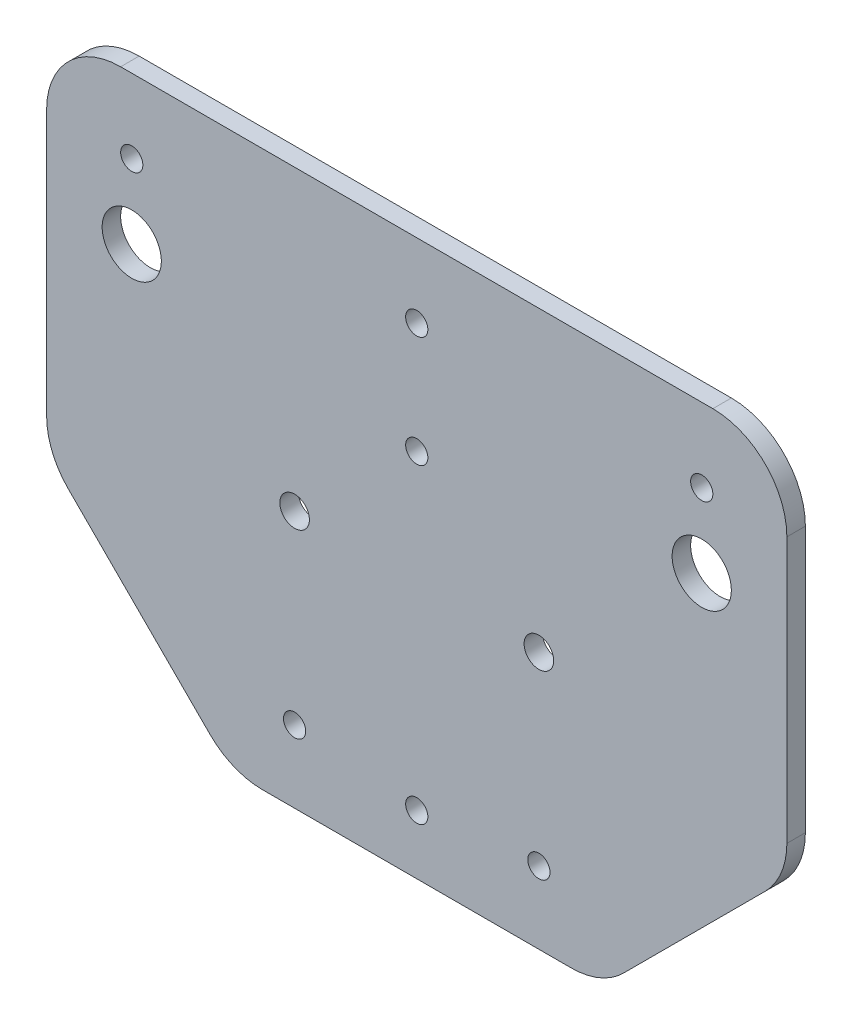
ISO-10303-21;
HEADER;
FILE_DESCRIPTION(('STEP AP214'),'2;1');
FILE_NAME('part.step','',(''),(''),'','','');
FILE_SCHEMA(('AUTOMOTIVE_DESIGN { 1 0 10303 214 1 1 1 1 }'));
ENDSEC;
DATA;
#1=APPLICATION_CONTEXT('core data for automotive mechanical design processes');
#2=APPLICATION_PROTOCOL_DEFINITION('international standard','automotive_design',2000,#1);
#3=PRODUCT_CONTEXT('',#1,'mechanical');
#4=PRODUCT('Part','Part','',(#3));
#5=PRODUCT_RELATED_PRODUCT_CATEGORY('part','',(#4));
#6=PRODUCT_DEFINITION_FORMATION('','',#4);
#7=PRODUCT_DEFINITION_CONTEXT('part definition',#1,'design');
#8=PRODUCT_DEFINITION('design','',#6,#7);
#9=PRODUCT_DEFINITION_SHAPE('','',#8);
#10=(LENGTH_UNIT() NAMED_UNIT(*) SI_UNIT(.MILLI.,.METRE.));
#11=(NAMED_UNIT(*) PLANE_ANGLE_UNIT() SI_UNIT($,.RADIAN.));
#12=(NAMED_UNIT(*) SI_UNIT($,.STERADIAN.) SOLID_ANGLE_UNIT());
#13=UNCERTAINTY_MEASURE_WITH_UNIT(LENGTH_MEASURE(1.E-05),#10,'distance_accuracy_value','');
#14=(GEOMETRIC_REPRESENTATION_CONTEXT(3) GLOBAL_UNCERTAINTY_ASSIGNED_CONTEXT((#13)) GLOBAL_UNIT_ASSIGNED_CONTEXT((#10,
#11,#12)) REPRESENTATION_CONTEXT('',''));
#15=CARTESIAN_POINT('',(0.,0.,0.));
#16=DIRECTION('',(0.,0.,1.));
#17=DIRECTION('',(1.,0.,0.));
#18=AXIS2_PLACEMENT_3D('',#15,#16,#17);
#19=CARTESIAN_POINT('',(-16.5,-2.74999999999998,1.25));
#20=DIRECTION('',(0.,0.,-1.));
#21=DIRECTION('',(-1.,0.,0.));
#22=AXIS2_PLACEMENT_3D('',#19,#20,#21);
#23=CYLINDRICAL_SURFACE('',#22,2.);
#24=CARTESIAN_POINT('',(-16.5,-2.74999999999998,1.25));
#25=DIRECTION('',(0.,0.,1.));
#26=DIRECTION('',(1.,0.,0.));
#27=AXIS2_PLACEMENT_3D('',#24,#25,#26);
#28=CIRCLE('',#27,2.);
#29=CARTESIAN_POINT('',(-14.5,-2.74999999999998,1.25));
#30=VERTEX_POINT('',#29);
#31=EDGE_CURVE('E293',#30,#30,#28,.T.);
#32=ORIENTED_EDGE('',*,*,#31,.T.);
#33=EDGE_LOOP('',(#32));
#34=FACE_BOUND('',#33,.T.);
#35=CARTESIAN_POINT('',(-16.5,-2.74999999999998,-1.25));
#36=DIRECTION('',(0.,0.,1.));
#37=DIRECTION('',(1.,0.,0.));
#38=AXIS2_PLACEMENT_3D('',#35,#36,#37);
#39=CIRCLE('',#38,2.);
#40=CARTESIAN_POINT('',(-14.5,-2.74999999999998,-1.25));
#41=VERTEX_POINT('',#40);
#42=EDGE_CURVE('E287',#41,#41,#39,.T.);
#43=ORIENTED_EDGE('',*,*,#42,.F.);
#44=EDGE_LOOP('',(#43));
#45=FACE_BOUND('',#44,.T.);
#46=ADVANCED_FACE('F123',(#34,#45),#23,.F.);
#47=CARTESIAN_POINT('',(-38.5,27.5,1.25));
#48=DIRECTION('',(0.,0.,-1.));
#49=DIRECTION('',(-1.,0.,0.));
#50=AXIS2_PLACEMENT_3D('',#47,#48,#49);
#51=CYLINDRICAL_SURFACE('',#50,1.5);
#52=CARTESIAN_POINT('',(-38.5,27.5,1.25));
#53=DIRECTION('',(0.,0.,1.));
#54=DIRECTION('',(1.,0.,0.));
#55=AXIS2_PLACEMENT_3D('',#52,#53,#54);
#56=CIRCLE('',#55,1.5);
#57=CARTESIAN_POINT('',(-37.,27.5,1.25));
#58=VERTEX_POINT('',#57);
#59=EDGE_CURVE('E399',#58,#58,#56,.F.);
#60=ORIENTED_EDGE('',*,*,#59,.F.);
#61=EDGE_LOOP('',(#60));
#62=FACE_BOUND('',#61,.T.);
#63=CARTESIAN_POINT('',(-38.5,27.5,-1.25));
#64=DIRECTION('',(0.,0.,1.));
#65=DIRECTION('',(1.,0.,0.));
#66=AXIS2_PLACEMENT_3D('',#63,#64,#65);
#67=CIRCLE('',#66,1.5);
#68=CARTESIAN_POINT('',(-37.,27.5,-1.25));
#69=VERTEX_POINT('',#68);
#70=EDGE_CURVE('E283',#69,#69,#67,.F.);
#71=ORIENTED_EDGE('',*,*,#70,.T.);
#72=EDGE_LOOP('',(#71));
#73=FACE_BOUND('',#72,.T.);
#74=ADVANCED_FACE('F494',(#62,#73),#51,.F.);
#75=CARTESIAN_POINT('',(38.5,27.5,1.25));
#76=DIRECTION('',(0.,0.,-1.));
#77=DIRECTION('',(-1.,0.,0.));
#78=AXIS2_PLACEMENT_3D('',#75,#76,#77);
#79=CYLINDRICAL_SURFACE('',#78,1.5);
#80=CARTESIAN_POINT('',(38.5,27.5,1.25));
#81=DIRECTION('',(0.,0.,1.));
#82=DIRECTION('',(1.,0.,0.));
#83=AXIS2_PLACEMENT_3D('',#80,#81,#82);
#84=CIRCLE('',#83,1.5);
#85=CARTESIAN_POINT('',(40.,27.5,1.25));
#86=VERTEX_POINT('',#85);
#87=EDGE_CURVE('E395',#86,#86,#84,.T.);
#88=ORIENTED_EDGE('',*,*,#87,.T.);
#89=EDGE_LOOP('',(#88));
#90=FACE_BOUND('',#89,.T.);
#91=CARTESIAN_POINT('',(38.5,27.5,-1.25));
#92=DIRECTION('',(0.,0.,1.));
#93=DIRECTION('',(1.,0.,0.));
#94=AXIS2_PLACEMENT_3D('',#91,#92,#93);
#95=CIRCLE('',#94,1.5);
#96=CARTESIAN_POINT('',(40.,27.5,-1.25));
#97=VERTEX_POINT('',#96);
#98=EDGE_CURVE('E279',#97,#97,#95,.T.);
#99=ORIENTED_EDGE('',*,*,#98,.F.);
#100=EDGE_LOOP('',(#99));
#101=FACE_BOUND('',#100,.T.);
#102=ADVANCED_FACE('F499',(#90,#101),#79,.F.);
#103=CARTESIAN_POINT('',(16.5,-2.74999999999997,1.25));
#104=DIRECTION('',(0.,0.,-1.));
#105=DIRECTION('',(-1.,0.,0.));
#106=AXIS2_PLACEMENT_3D('',#103,#104,#105);
#107=CYLINDRICAL_SURFACE('',#106,2.);
#108=CARTESIAN_POINT('',(16.5,-2.74999999999997,1.25));
#109=DIRECTION('',(0.,0.,1.));
#110=DIRECTION('',(1.,0.,0.));
#111=AXIS2_PLACEMENT_3D('',#108,#109,#110);
#112=CIRCLE('',#111,2.);
#113=CARTESIAN_POINT('',(18.5,-2.74999999999997,1.25));
#114=VERTEX_POINT('',#113);
#115=EDGE_CURVE('E391',#114,#114,#112,.T.);
#116=ORIENTED_EDGE('',*,*,#115,.T.);
#117=EDGE_LOOP('',(#116));
#118=FACE_BOUND('',#117,.T.);
#119=CARTESIAN_POINT('',(16.5,-2.74999999999997,-1.25));
#120=DIRECTION('',(0.,0.,1.));
#121=DIRECTION('',(1.,0.,0.));
#122=AXIS2_PLACEMENT_3D('',#119,#120,#121);
#123=CIRCLE('',#122,2.);
#124=CARTESIAN_POINT('',(18.5,-2.74999999999997,-1.25));
#125=VERTEX_POINT('',#124);
#126=EDGE_CURVE('E275',#125,#125,#123,.T.);
#127=ORIENTED_EDGE('',*,*,#126,.F.);
#128=EDGE_LOOP('',(#127));
#129=FACE_BOUND('',#128,.T.);
#130=ADVANCED_FACE('F506',(#118,#129),#107,.F.);
#131=CARTESIAN_POINT('',(16.5,-27.75,1.25));
#132=DIRECTION('',(0.,0.,-1.));
#133=DIRECTION('',(-1.,0.,0.));
#134=AXIS2_PLACEMENT_3D('',#131,#132,#133);
#135=CYLINDRICAL_SURFACE('',#134,1.5);
#136=CARTESIAN_POINT('',(16.5,-27.75,1.25));
#137=DIRECTION('',(0.,0.,1.));
#138=DIRECTION('',(1.,0.,0.));
#139=AXIS2_PLACEMENT_3D('',#136,#137,#138);
#140=CIRCLE('',#139,1.5);
#141=CARTESIAN_POINT('',(18.,-27.75,1.25));
#142=VERTEX_POINT('',#141);
#143=EDGE_CURVE('E387',#142,#142,#140,.F.);
#144=ORIENTED_EDGE('',*,*,#143,.F.);
#145=EDGE_LOOP('',(#144));
#146=FACE_BOUND('',#145,.T.);
#147=CARTESIAN_POINT('',(16.5,-27.75,-1.25));
#148=DIRECTION('',(0.,0.,1.));
#149=DIRECTION('',(1.,0.,0.));
#150=AXIS2_PLACEMENT_3D('',#147,#148,#149);
#151=CIRCLE('',#150,1.5);
#152=CARTESIAN_POINT('',(18.,-27.75,-1.25));
#153=VERTEX_POINT('',#152);
#154=EDGE_CURVE('E271',#153,#153,#151,.F.);
#155=ORIENTED_EDGE('',*,*,#154,.T.);
#156=EDGE_LOOP('',(#155));
#157=FACE_BOUND('',#156,.T.);
#158=ADVANCED_FACE('F510',(#146,#157),#135,.F.);
#159=CARTESIAN_POINT('',(-16.5,-27.75,1.25));
#160=DIRECTION('',(0.,0.,-1.));
#161=DIRECTION('',(-1.,0.,0.));
#162=AXIS2_PLACEMENT_3D('',#159,#160,#161);
#163=CYLINDRICAL_SURFACE('',#162,1.5);
#164=CARTESIAN_POINT('',(-16.5,-27.75,1.25));
#165=DIRECTION('',(0.,0.,1.));
#166=DIRECTION('',(1.,0.,0.));
#167=AXIS2_PLACEMENT_3D('',#164,#165,#166);
#168=CIRCLE('',#167,1.5);
#169=CARTESIAN_POINT('',(-15.,-27.75,1.25));
#170=VERTEX_POINT('',#169);
#171=EDGE_CURVE('E383',#170,#170,#168,.T.);
#172=ORIENTED_EDGE('',*,*,#171,.T.);
#173=EDGE_LOOP('',(#172));
#174=FACE_BOUND('',#173,.T.);
#175=CARTESIAN_POINT('',(-16.5,-27.75,-1.25));
#176=DIRECTION('',(0.,0.,1.));
#177=DIRECTION('',(1.,0.,0.));
#178=AXIS2_PLACEMENT_3D('',#175,#176,#177);
#179=CIRCLE('',#178,1.5);
#180=CARTESIAN_POINT('',(-15.,-27.75,-1.25));
#181=VERTEX_POINT('',#180);
#182=EDGE_CURVE('E267',#181,#181,#179,.T.);
#183=ORIENTED_EDGE('',*,*,#182,.F.);
#184=EDGE_LOOP('',(#183));
#185=FACE_BOUND('',#184,.T.);
#186=ADVANCED_FACE('F514',(#174,#185),#163,.F.);
#187=CARTESIAN_POINT('',(0.,-29.5,1.25));
#188=DIRECTION('',(0.,0.,-1.));
#189=DIRECTION('',(-1.,0.,0.));
#190=AXIS2_PLACEMENT_3D('',#187,#188,#189);
#191=CYLINDRICAL_SURFACE('',#190,1.5);
#192=CARTESIAN_POINT('',(0.,-29.5,1.25));
#193=DIRECTION('',(0.,0.,1.));
#194=DIRECTION('',(1.,0.,0.));
#195=AXIS2_PLACEMENT_3D('',#192,#193,#194);
#196=CIRCLE('',#195,1.5);
#197=CARTESIAN_POINT('',(1.5,-29.5,1.25));
#198=VERTEX_POINT('',#197);
#199=EDGE_CURVE('E375',#198,#198,#196,.T.);
#200=ORIENTED_EDGE('',*,*,#199,.T.);
#201=EDGE_LOOP('',(#200));
#202=FACE_BOUND('',#201,.T.);
#203=CARTESIAN_POINT('',(0.,-29.5,-1.25));
#204=DIRECTION('',(0.,0.,1.));
#205=DIRECTION('',(1.,0.,0.));
#206=AXIS2_PLACEMENT_3D('',#203,#204,#205);
#207=CIRCLE('',#206,1.5);
#208=CARTESIAN_POINT('',(1.5,-29.5,-1.25));
#209=VERTEX_POINT('',#208);
#210=EDGE_CURVE('E263',#209,#209,#207,.T.);
#211=ORIENTED_EDGE('',*,*,#210,.F.);
#212=EDGE_LOOP('',(#211));
#213=FACE_BOUND('',#212,.T.);
#214=ADVANCED_FACE('F518',(#202,#213),#191,.F.);
#215=CARTESIAN_POINT('',(0.,37.5,1.25));
#216=DIRECTION('',(0.,-1.,0.));
#217=DIRECTION('',(0.,0.,-1.));
#218=AXIS2_PLACEMENT_3D('',#215,#216,#217);
#219=PLANE('',#218);
#220=DIRECTION('',(-1.,0.,0.));
#221=VECTOR('',#220,1.);
#222=CARTESIAN_POINT('',(0.,37.5,-1.25));
#223=LINE('',#222,#221);
#224=CARTESIAN_POINT('',(40.,37.5,-1.25));
#225=VERTEX_POINT('',#224);
#226=CARTESIAN_POINT('',(-40.,37.5,-1.25));
#227=VERTEX_POINT('',#226);
#228=EDGE_CURVE('E245',#225,#227,#223,.T.);
#229=ORIENTED_EDGE('',*,*,#228,.T.);
#230=DIRECTION('',(0.,0.,-1.));
#231=VECTOR('',#230,1.);
#232=CARTESIAN_POINT('',(-40.,37.5,1.25));
#233=LINE('',#232,#231);
#234=CARTESIAN_POINT('',(-40.,37.5,1.25));
#235=VERTEX_POINT('',#234);
#236=EDGE_CURVE('E219',#227,#235,#233,.F.);
#237=ORIENTED_EDGE('',*,*,#236,.T.);
#238=DIRECTION('',(-1.,0.,0.));
#239=VECTOR('',#238,1.);
#240=CARTESIAN_POINT('',(0.,37.5,1.25));
#241=LINE('',#240,#239);
#242=CARTESIAN_POINT('',(40.,37.5,1.25));
#243=VERTEX_POINT('',#242);
#244=EDGE_CURVE('E438',#243,#235,#241,.T.);
#245=ORIENTED_EDGE('',*,*,#244,.F.);
#246=DIRECTION('',(0.,0.,-1.));
#247=VECTOR('',#246,1.);
#248=CARTESIAN_POINT('',(40.,37.5,-1.25));
#249=LINE('',#248,#247);
#250=EDGE_CURVE('E225',#243,#225,#249,.T.);
#251=ORIENTED_EDGE('',*,*,#250,.T.);
#252=EDGE_LOOP('',(#229,#237,#245,#251));
#253=FACE_BOUND('',#252,.T.);
#254=ADVANCED_FACE('F441',(#253),#219,.F.);
#255=CARTESIAN_POINT('',(-50.,0.,1.25));
#256=DIRECTION('',(1.,0.,0.));
#257=DIRECTION('',(0.,0.,-1.));
#258=AXIS2_PLACEMENT_3D('',#255,#256,#257);
#259=PLANE('',#258);
#260=DIRECTION('',(0.,-1.,0.));
#261=VECTOR('',#260,1.);
#262=CARTESIAN_POINT('',(-50.,0.,1.25));
#263=LINE('',#262,#261);
#264=CARTESIAN_POINT('',(-50.,27.5,1.25));
#265=VERTEX_POINT('',#264);
#266=CARTESIAN_POINT('',(-50.,-8.35786437626905,1.25));
#267=VERTEX_POINT('',#266);
#268=EDGE_CURVE('E235',#265,#267,#263,.T.);
#269=ORIENTED_EDGE('',*,*,#268,.F.);
#270=DIRECTION('',(0.,0.,-1.));
#271=VECTOR('',#270,1.);
#272=CARTESIAN_POINT('',(-50.,27.5,1.25));
#273=LINE('',#272,#271);
#274=CARTESIAN_POINT('',(-50.,27.5,-1.25));
#275=VERTEX_POINT('',#274);
#276=EDGE_CURVE('E218',#265,#275,#273,.T.);
#277=ORIENTED_EDGE('',*,*,#276,.T.);
#278=DIRECTION('',(0.,-1.,0.));
#279=VECTOR('',#278,1.);
#280=CARTESIAN_POINT('',(-50.,0.,-1.25));
#281=LINE('',#280,#279);
#282=CARTESIAN_POINT('',(-50.,-8.35786437626905,-1.25));
#283=VERTEX_POINT('',#282);
#284=EDGE_CURVE('E232',#275,#283,#281,.T.);
#285=ORIENTED_EDGE('',*,*,#284,.T.);
#286=DIRECTION('',(0.,0.,-1.));
#287=VECTOR('',#286,1.);
#288=CARTESIAN_POINT('',(-50.,-8.35786437626905,1.25));
#289=LINE('',#288,#287);
#290=EDGE_CURVE('E238',#283,#267,#289,.F.);
#291=ORIENTED_EDGE('',*,*,#290,.T.);
#292=EDGE_LOOP('',(#269,#277,#285,#291));
#293=FACE_BOUND('',#292,.T.);
#294=ADVANCED_FACE('F231',(#293),#259,.F.);
#295=CARTESIAN_POINT('',(-31.25,-31.25,1.25));
#296=DIRECTION('',(0.707106781186547,0.707106781186548,0.));
#297=DIRECTION('',(-0.707106781186548,0.707106781186547,0.));
#298=AXIS2_PLACEMENT_3D('',#295,#296,#297);
#299=PLANE('',#298);
#300=DIRECTION('',(0.707106781186548,-0.707106781186547,0.));
#301=VECTOR('',#300,1.);
#302=CARTESIAN_POINT('',(-31.25,-31.25,-1.25));
#303=LINE('',#302,#301);
#304=CARTESIAN_POINT('',(-47.0710678118655,-15.4289321881345,-1.25));
#305=VERTEX_POINT('',#304);
#306=CARTESIAN_POINT('',(-27.9289321881345,-34.5710678118655,-1.25));
#307=VERTEX_POINT('',#306);
#308=EDGE_CURVE('E244',#305,#307,#303,.T.);
#309=ORIENTED_EDGE('',*,*,#308,.T.);
#310=DIRECTION('',(0.,0.,-1.));
#311=VECTOR('',#310,1.);
#312=CARTESIAN_POINT('',(-27.9289321881345,-34.5710678118655,1.25));
#313=LINE('',#312,#311);
#314=CARTESIAN_POINT('',(-27.9289321881345,-34.5710678118655,1.25));
#315=VERTEX_POINT('',#314);
#316=EDGE_CURVE('E12',#307,#315,#313,.F.);
#317=ORIENTED_EDGE('',*,*,#316,.T.);
#318=DIRECTION('',(0.707106781186548,-0.707106781186547,0.));
#319=VECTOR('',#318,1.);
#320=CARTESIAN_POINT('',(-31.25,-31.25,1.25));
#321=LINE('',#320,#319);
#322=CARTESIAN_POINT('',(-47.0710678118655,-15.4289321881345,1.25));
#323=VERTEX_POINT('',#322);
#324=EDGE_CURVE('E357',#323,#315,#321,.T.);
#325=ORIENTED_EDGE('',*,*,#324,.F.);
#326=DIRECTION('',(0.,0.,-1.));
#327=VECTOR('',#326,1.);
#328=CARTESIAN_POINT('',(-47.0710678118655,-15.4289321881345,1.25));
#329=LINE('',#328,#327);
#330=EDGE_CURVE('E132',#323,#305,#329,.T.);
#331=ORIENTED_EDGE('',*,*,#330,.T.);
#332=EDGE_LOOP('',(#309,#317,#325,#331));
#333=FACE_BOUND('',#332,.T.);
#334=ADVANCED_FACE('F354',(#333),#299,.F.);
#335=CARTESIAN_POINT('',(0.,-37.5,1.25));
#336=DIRECTION('',(0.,1.,0.));
#337=DIRECTION('',(-1.,0.,0.));
#338=AXIS2_PLACEMENT_3D('',#335,#336,#337);
#339=PLANE('',#338);
#340=DIRECTION('',(1.,0.,0.));
#341=VECTOR('',#340,1.);
#342=CARTESIAN_POINT('',(0.,-37.5,-1.25));
#343=LINE('',#342,#341);
#344=CARTESIAN_POINT('',(-20.857864376269,-37.5,-1.25));
#345=VERTEX_POINT('',#344);
#346=CARTESIAN_POINT('',(20.8578643762691,-37.5,-1.25));
#347=VERTEX_POINT('',#346);
#348=EDGE_CURVE('E250',#345,#347,#343,.T.);
#349=ORIENTED_EDGE('',*,*,#348,.T.);
#350=DIRECTION('',(0.,0.,-1.));
#351=VECTOR('',#350,1.);
#352=CARTESIAN_POINT('',(20.8578643762691,-37.5,1.25));
#353=LINE('',#352,#351);
#354=CARTESIAN_POINT('',(20.8578643762691,-37.5,1.25));
#355=VERTEX_POINT('',#354);
#356=EDGE_CURVE('E347',#347,#355,#353,.F.);
#357=ORIENTED_EDGE('',*,*,#356,.T.);
#358=DIRECTION('',(1.,0.,0.));
#359=VECTOR('',#358,1.);
#360=CARTESIAN_POINT('',(0.,-37.5,1.25));
#361=LINE('',#360,#359);
#362=CARTESIAN_POINT('',(-20.857864376269,-37.5,1.25));
#363=VERTEX_POINT('',#362);
#364=EDGE_CURVE('E369',#363,#355,#361,.T.);
#365=ORIENTED_EDGE('',*,*,#364,.F.);
#366=DIRECTION('',(0.,0.,-1.));
#367=VECTOR('',#366,1.);
#368=CARTESIAN_POINT('',(-20.857864376269,-37.5,1.25));
#369=LINE('',#368,#367);
#370=EDGE_CURVE('E343',#363,#345,#369,.T.);
#371=ORIENTED_EDGE('',*,*,#370,.T.);
#372=EDGE_LOOP('',(#349,#357,#365,#371));
#373=FACE_BOUND('',#372,.T.);
#374=ADVANCED_FACE('F367',(#373),#339,.F.);
#375=CARTESIAN_POINT('',(31.25,-31.25,1.25));
#376=DIRECTION('',(0.707106781186547,-0.707106781186548,0.));
#377=DIRECTION('',(0.707106781186548,0.707106781186547,0.));
#378=AXIS2_PLACEMENT_3D('',#375,#376,#377);
#379=PLANE('',#378);
#380=DIRECTION('',(-0.707106781186548,-0.707106781186547,0.));
#381=VECTOR('',#380,1.);
#382=CARTESIAN_POINT('',(31.25,-31.25,-1.25));
#383=LINE('',#382,#381);
#384=CARTESIAN_POINT('',(47.0710678118655,-15.4289321881345,-1.25));
#385=VERTEX_POINT('',#384);
#386=CARTESIAN_POINT('',(27.9289321881345,-34.5710678118655,-1.25));
#387=VERTEX_POINT('',#386);
#388=EDGE_CURVE('E259',#385,#387,#383,.T.);
#389=ORIENTED_EDGE('',*,*,#388,.F.);
#390=DIRECTION('',(0.,0.,-1.));
#391=VECTOR('',#390,1.);
#392=CARTESIAN_POINT('',(47.0710678118655,-15.4289321881345,1.25));
#393=LINE('',#392,#391);
#394=CARTESIAN_POINT('',(47.0710678118655,-15.4289321881345,1.25));
#395=VERTEX_POINT('',#394);
#396=EDGE_CURVE('E146',#385,#395,#393,.F.);
#397=ORIENTED_EDGE('',*,*,#396,.T.);
#398=DIRECTION('',(-0.707106781186548,-0.707106781186547,0.));
#399=VECTOR('',#398,1.);
#400=CARTESIAN_POINT('',(31.25,-31.25,1.25));
#401=LINE('',#400,#399);
#402=CARTESIAN_POINT('',(27.9289321881345,-34.5710678118655,1.25));
#403=VERTEX_POINT('',#402);
#404=EDGE_CURVE('E371',#395,#403,#401,.T.);
#405=ORIENTED_EDGE('',*,*,#404,.T.);
#406=DIRECTION('',(0.,0.,-1.));
#407=VECTOR('',#406,1.);
#408=CARTESIAN_POINT('',(27.9289321881345,-34.5710678118655,-1.25));
#409=LINE('',#408,#407);
#410=EDGE_CURVE('E337',#403,#387,#409,.T.);
#411=ORIENTED_EDGE('',*,*,#410,.T.);
#412=EDGE_LOOP('',(#389,#397,#405,#411));
#413=FACE_BOUND('',#412,.T.);
#414=ADVANCED_FACE('F523',(#413),#379,.T.);
#415=CARTESIAN_POINT('',(50.,0.,1.25));
#416=DIRECTION('',(1.,0.,0.));
#417=DIRECTION('',(0.,0.,-1.));
#418=AXIS2_PLACEMENT_3D('',#415,#416,#417);
#419=PLANE('',#418);
#420=DIRECTION('',(0.,-1.,0.));
#421=VECTOR('',#420,1.);
#422=CARTESIAN_POINT('',(50.,0.,-1.25));
#423=LINE('',#422,#421);
#424=CARTESIAN_POINT('',(50.,27.5,-1.25));
#425=VERTEX_POINT('',#424);
#426=CARTESIAN_POINT('',(50.,-8.35786437626906,-1.25));
#427=VERTEX_POINT('',#426);
#428=EDGE_CURVE('E252',#425,#427,#423,.T.);
#429=ORIENTED_EDGE('',*,*,#428,.F.);
#430=DIRECTION('',(0.,0.,-1.));
#431=VECTOR('',#430,1.);
#432=CARTESIAN_POINT('',(50.,27.5,1.25));
#433=LINE('',#432,#431);
#434=CARTESIAN_POINT('',(50.,27.5,1.25));
#435=VERTEX_POINT('',#434);
#436=EDGE_CURVE('E334',#425,#435,#433,.F.);
#437=ORIENTED_EDGE('',*,*,#436,.T.);
#438=DIRECTION('',(0.,-1.,0.));
#439=VECTOR('',#438,1.);
#440=CARTESIAN_POINT('',(50.,0.,1.25));
#441=LINE('',#440,#439);
#442=CARTESIAN_POINT('',(50.,-8.35786437626906,1.25));
#443=VERTEX_POINT('',#442);
#444=EDGE_CURVE('E439',#435,#443,#441,.T.);
#445=ORIENTED_EDGE('',*,*,#444,.T.);
#446=DIRECTION('',(0.,0.,-1.));
#447=VECTOR('',#446,1.);
#448=CARTESIAN_POINT('',(50.,-8.35786437626906,1.25));
#449=LINE('',#448,#447);
#450=EDGE_CURVE('E330',#443,#427,#449,.T.);
#451=ORIENTED_EDGE('',*,*,#450,.T.);
#452=EDGE_LOOP('',(#429,#437,#445,#451));
#453=FACE_BOUND('',#452,.T.);
#454=ADVANCED_FACE('F426',(#453),#419,.T.);
#455=CARTESIAN_POINT('',(-38.5,17.5,1.25));
#456=DIRECTION('',(0.,0.,-1.));
#457=DIRECTION('',(-1.,0.,0.));
#458=AXIS2_PLACEMENT_3D('',#455,#456,#457);
#459=CYLINDRICAL_SURFACE('',#458,4.);
#460=CARTESIAN_POINT('',(-38.5,17.5,1.25));
#461=DIRECTION('',(0.,0.,1.));
#462=DIRECTION('',(1.,0.,0.));
#463=AXIS2_PLACEMENT_3D('',#460,#461,#462);
#464=CIRCLE('',#463,4.);
#465=CARTESIAN_POINT('',(-34.5,17.5,1.25));
#466=VERTEX_POINT('',#465);
#467=EDGE_CURVE('E446',#466,#466,#464,.T.);
#468=ORIENTED_EDGE('',*,*,#467,.T.);
#469=EDGE_LOOP('',(#468));
#470=FACE_BOUND('',#469,.T.);
#471=CARTESIAN_POINT('',(-38.5,17.5,-1.25));
#472=DIRECTION('',(0.,0.,1.));
#473=DIRECTION('',(1.,0.,0.));
#474=AXIS2_PLACEMENT_3D('',#471,#472,#473);
#475=CIRCLE('',#474,4.);
#476=CARTESIAN_POINT('',(-34.5,17.5,-1.25));
#477=VERTEX_POINT('',#476);
#478=EDGE_CURVE('E418',#477,#477,#475,.T.);
#479=ORIENTED_EDGE('',*,*,#478,.F.);
#480=EDGE_LOOP('',(#479));
#481=FACE_BOUND('',#480,.T.);
#482=ADVANCED_FACE('F476',(#470,#481),#459,.F.);
#483=CARTESIAN_POINT('',(38.5,17.5,1.25));
#484=DIRECTION('',(0.,0.,-1.));
#485=DIRECTION('',(-1.,0.,0.));
#486=AXIS2_PLACEMENT_3D('',#483,#484,#485);
#487=CYLINDRICAL_SURFACE('',#486,4.);
#488=CARTESIAN_POINT('',(38.5,17.5,1.25));
#489=DIRECTION('',(0.,0.,1.));
#490=DIRECTION('',(1.,0.,0.));
#491=AXIS2_PLACEMENT_3D('',#488,#489,#490);
#492=CIRCLE('',#491,4.);
#493=CARTESIAN_POINT('',(42.5,17.5,1.25));
#494=VERTEX_POINT('',#493);
#495=EDGE_CURVE('E452',#494,#494,#492,.F.);
#496=ORIENTED_EDGE('',*,*,#495,.F.);
#497=EDGE_LOOP('',(#496));
#498=FACE_BOUND('',#497,.T.);
#499=CARTESIAN_POINT('',(38.5,17.5,-1.25));
#500=DIRECTION('',(0.,0.,1.));
#501=DIRECTION('',(1.,0.,0.));
#502=AXIS2_PLACEMENT_3D('',#499,#500,#501);
#503=CIRCLE('',#502,4.);
#504=CARTESIAN_POINT('',(42.5,17.5,-1.25));
#505=VERTEX_POINT('',#504);
#506=EDGE_CURVE('E414',#505,#505,#503,.F.);
#507=ORIENTED_EDGE('',*,*,#506,.T.);
#508=EDGE_LOOP('',(#507));
#509=FACE_BOUND('',#508,.T.);
#510=ADVANCED_FACE('F479',(#498,#509),#487,.F.);
#511=CARTESIAN_POINT('',(0.,12.5,1.25));
#512=DIRECTION('',(0.,0.,-1.));
#513=DIRECTION('',(-1.,0.,0.));
#514=AXIS2_PLACEMENT_3D('',#511,#512,#513);
#515=CYLINDRICAL_SURFACE('',#514,1.5);
#516=CARTESIAN_POINT('',(0.,12.5,1.25));
#517=DIRECTION('',(0.,0.,1.));
#518=DIRECTION('',(1.,0.,0.));
#519=AXIS2_PLACEMENT_3D('',#516,#517,#518);
#520=CIRCLE('',#519,1.5);
#521=CARTESIAN_POINT('',(1.50000000000005,12.5,1.25));
#522=VERTEX_POINT('',#521);
#523=EDGE_CURVE('E456',#522,#522,#520,.T.);
#524=ORIENTED_EDGE('',*,*,#523,.T.);
#525=EDGE_LOOP('',(#524));
#526=FACE_BOUND('',#525,.T.);
#527=CARTESIAN_POINT('',(0.,12.5,-1.25));
#528=DIRECTION('',(0.,0.,1.));
#529=DIRECTION('',(1.,0.,0.));
#530=AXIS2_PLACEMENT_3D('',#527,#528,#529);
#531=CIRCLE('',#530,1.5);
#532=CARTESIAN_POINT('',(1.50000000000005,12.5,-1.25));
#533=VERTEX_POINT('',#532);
#534=EDGE_CURVE('E410',#533,#533,#531,.T.);
#535=ORIENTED_EDGE('',*,*,#534,.F.);
#536=EDGE_LOOP('',(#535));
#537=FACE_BOUND('',#536,.T.);
#538=ADVANCED_FACE('F489',(#526,#537),#515,.F.);
#539=CARTESIAN_POINT('',(0.,27.5,1.25));
#540=DIRECTION('',(0.,0.,-1.));
#541=DIRECTION('',(-1.,0.,0.));
#542=AXIS2_PLACEMENT_3D('',#539,#540,#541);
#543=CYLINDRICAL_SURFACE('',#542,1.5);
#544=CARTESIAN_POINT('',(0.,27.5,1.25));
#545=DIRECTION('',(0.,0.,1.));
#546=DIRECTION('',(1.,0.,0.));
#547=AXIS2_PLACEMENT_3D('',#544,#545,#546);
#548=CIRCLE('',#547,1.5);
#549=CARTESIAN_POINT('',(1.5,27.5,1.25));
#550=VERTEX_POINT('',#549);
#551=EDGE_CURVE('E291',#550,#550,#548,.T.);
#552=ORIENTED_EDGE('',*,*,#551,.T.);
#553=EDGE_LOOP('',(#552));
#554=FACE_BOUND('',#553,.T.);
#555=CARTESIAN_POINT('',(0.,27.5,-1.25));
#556=DIRECTION('',(0.,0.,1.));
#557=DIRECTION('',(1.,0.,0.));
#558=AXIS2_PLACEMENT_3D('',#555,#556,#557);
#559=CIRCLE('',#558,1.5);
#560=CARTESIAN_POINT('',(1.5,27.5,-1.25));
#561=VERTEX_POINT('',#560);
#562=EDGE_CURVE('E406',#561,#561,#559,.T.);
#563=ORIENTED_EDGE('',*,*,#562,.F.);
#564=EDGE_LOOP('',(#563));
#565=FACE_BOUND('',#564,.T.);
#566=ADVANCED_FACE('F464',(#554,#565),#543,.F.);
#567=CARTESIAN_POINT('',(0.,0.,-1.25));
#568=DIRECTION('',(0.,0.,1.));
#569=DIRECTION('',(1.,0.,0.));
#570=AXIS2_PLACEMENT_3D('',#567,#568,#569);
#571=PLANE('',#570);
#572=ORIENTED_EDGE('',*,*,#562,.T.);
#573=EDGE_LOOP('',(#572));
#574=FACE_BOUND('',#573,.T.);
#575=ORIENTED_EDGE('',*,*,#534,.T.);
#576=EDGE_LOOP('',(#575));
#577=FACE_BOUND('',#576,.T.);
#578=ORIENTED_EDGE('',*,*,#506,.F.);
#579=EDGE_LOOP('',(#578));
#580=FACE_BOUND('',#579,.T.);
#581=ORIENTED_EDGE('',*,*,#478,.T.);
#582=EDGE_LOOP('',(#581));
#583=FACE_BOUND('',#582,.T.);
#584=ORIENTED_EDGE('',*,*,#284,.F.);
#585=CARTESIAN_POINT('',(-40.,27.5,-1.25));
#586=DIRECTION('',(0.,0.,1.));
#587=DIRECTION('',(1.,0.,0.));
#588=AXIS2_PLACEMENT_3D('',#585,#586,#587);
#589=CIRCLE('',#588,10.);
#590=EDGE_CURVE('E214',#275,#227,#589,.F.);
#591=ORIENTED_EDGE('',*,*,#590,.T.);
#592=ORIENTED_EDGE('',*,*,#228,.F.);
#593=CARTESIAN_POINT('',(40.,27.5,-1.25));
#594=DIRECTION('',(0.,0.,1.));
#595=DIRECTION('',(1.,0.,0.));
#596=AXIS2_PLACEMENT_3D('',#593,#594,#595);
#597=CIRCLE('',#596,10.);
#598=EDGE_CURVE('E226',#225,#425,#597,.F.);
#599=ORIENTED_EDGE('',*,*,#598,.T.);
#600=ORIENTED_EDGE('',*,*,#428,.T.);
#601=CARTESIAN_POINT('',(40.,-8.35786437626906,-1.25));
#602=DIRECTION('',(0.,0.,1.));
#603=DIRECTION('',(1.,0.,0.));
#604=AXIS2_PLACEMENT_3D('',#601,#602,#603);
#605=CIRCLE('',#604,10.);
#606=EDGE_CURVE('E303',#427,#385,#605,.F.);
#607=ORIENTED_EDGE('',*,*,#606,.T.);
#608=ORIENTED_EDGE('',*,*,#388,.T.);
#609=CARTESIAN_POINT('',(20.8578643762691,-27.5,-1.25));
#610=DIRECTION('',(0.,0.,1.));
#611=DIRECTION('',(1.,0.,0.));
#612=AXIS2_PLACEMENT_3D('',#609,#610,#611);
#613=CIRCLE('',#612,10.);
#614=EDGE_CURVE('E300',#387,#347,#613,.F.);
#615=ORIENTED_EDGE('',*,*,#614,.T.);
#616=ORIENTED_EDGE('',*,*,#348,.F.);
#617=CARTESIAN_POINT('',(-20.857864376269,-27.5,-1.25));
#618=DIRECTION('',(0.,0.,1.));
#619=DIRECTION('',(1.,0.,0.));
#620=AXIS2_PLACEMENT_3D('',#617,#618,#619);
#621=CIRCLE('',#620,10.);
#622=EDGE_CURVE('E297',#345,#307,#621,.F.);
#623=ORIENTED_EDGE('',*,*,#622,.T.);
#624=ORIENTED_EDGE('',*,*,#308,.F.);
#625=CARTESIAN_POINT('',(-40.,-8.35786437626905,-1.25));
#626=DIRECTION('',(0.,0.,1.));
#627=DIRECTION('',(1.,0.,0.));
#628=AXIS2_PLACEMENT_3D('',#625,#626,#627);
#629=CIRCLE('',#628,10.);
#630=EDGE_CURVE('E237',#305,#283,#629,.F.);
#631=ORIENTED_EDGE('',*,*,#630,.T.);
#632=EDGE_LOOP('',(#584,#591,#592,#599,#600,#607,#608,#615,#616,#623,#624,#631));
#633=FACE_BOUND('',#632,.T.);
#634=ORIENTED_EDGE('',*,*,#210,.T.);
#635=EDGE_LOOP('',(#634));
#636=FACE_BOUND('',#635,.T.);
#637=ORIENTED_EDGE('',*,*,#182,.T.);
#638=EDGE_LOOP('',(#637));
#639=FACE_BOUND('',#638,.T.);
#640=ORIENTED_EDGE('',*,*,#154,.F.);
#641=EDGE_LOOP('',(#640));
#642=FACE_BOUND('',#641,.T.);
#643=ORIENTED_EDGE('',*,*,#126,.T.);
#644=EDGE_LOOP('',(#643));
#645=FACE_BOUND('',#644,.T.);
#646=ORIENTED_EDGE('',*,*,#98,.T.);
#647=EDGE_LOOP('',(#646));
#648=FACE_BOUND('',#647,.T.);
#649=ORIENTED_EDGE('',*,*,#70,.F.);
#650=EDGE_LOOP('',(#649));
#651=FACE_BOUND('',#650,.T.);
#652=ORIENTED_EDGE('',*,*,#42,.T.);
#653=EDGE_LOOP('',(#652));
#654=FACE_BOUND('',#653,.T.);
#655=ADVANCED_FACE('F240',(#574,#577,#580,#583,#633,#636,#639,#642,#645,#648,#651,#654),#571,.F.);
#656=CARTESIAN_POINT('',(0.,0.,1.25));
#657=DIRECTION('',(0.,0.,1.));
#658=DIRECTION('',(1.,0.,0.));
#659=AXIS2_PLACEMENT_3D('',#656,#657,#658);
#660=PLANE('',#659);
#661=ORIENTED_EDGE('',*,*,#551,.F.);
#662=EDGE_LOOP('',(#661));
#663=FACE_BOUND('',#662,.T.);
#664=ORIENTED_EDGE('',*,*,#523,.F.);
#665=EDGE_LOOP('',(#664));
#666=FACE_BOUND('',#665,.T.);
#667=ORIENTED_EDGE('',*,*,#495,.T.);
#668=EDGE_LOOP('',(#667));
#669=FACE_BOUND('',#668,.T.);
#670=ORIENTED_EDGE('',*,*,#467,.F.);
#671=EDGE_LOOP('',(#670));
#672=FACE_BOUND('',#671,.T.);
#673=ORIENTED_EDGE('',*,*,#244,.T.);
#674=CARTESIAN_POINT('',(-40.,27.5,1.25));
#675=DIRECTION('',(0.,0.,1.));
#676=DIRECTION('',(1.,0.,0.));
#677=AXIS2_PLACEMENT_3D('',#674,#675,#676);
#678=CIRCLE('',#677,10.);
#679=EDGE_CURVE('E327',#235,#265,#678,.T.);
#680=ORIENTED_EDGE('',*,*,#679,.T.);
#681=ORIENTED_EDGE('',*,*,#268,.T.);
#682=CARTESIAN_POINT('',(-40.,-8.35786437626905,1.25));
#683=DIRECTION('',(0.,0.,1.));
#684=DIRECTION('',(1.,0.,0.));
#685=AXIS2_PLACEMENT_3D('',#682,#683,#684);
#686=CIRCLE('',#685,10.);
#687=EDGE_CURVE('E313',#267,#323,#686,.T.);
#688=ORIENTED_EDGE('',*,*,#687,.T.);
#689=ORIENTED_EDGE('',*,*,#324,.T.);
#690=CARTESIAN_POINT('',(-20.857864376269,-27.5,1.25));
#691=DIRECTION('',(0.,0.,1.));
#692=DIRECTION('',(1.,0.,0.));
#693=AXIS2_PLACEMENT_3D('',#690,#691,#692);
#694=CIRCLE('',#693,10.);
#695=EDGE_CURVE('E316',#315,#363,#694,.T.);
#696=ORIENTED_EDGE('',*,*,#695,.T.);
#697=ORIENTED_EDGE('',*,*,#364,.T.);
#698=CARTESIAN_POINT('',(20.8578643762691,-27.5,1.25));
#699=DIRECTION('',(0.,0.,1.));
#700=DIRECTION('',(1.,0.,0.));
#701=AXIS2_PLACEMENT_3D('',#698,#699,#700);
#702=CIRCLE('',#701,10.);
#703=EDGE_CURVE('E139',#355,#403,#702,.T.);
#704=ORIENTED_EDGE('',*,*,#703,.T.);
#705=ORIENTED_EDGE('',*,*,#404,.F.);
#706=CARTESIAN_POINT('',(40.,-8.35786437626906,1.25));
#707=DIRECTION('',(0.,0.,1.));
#708=DIRECTION('',(1.,0.,0.));
#709=AXIS2_PLACEMENT_3D('',#706,#707,#708);
#710=CIRCLE('',#709,10.);
#711=EDGE_CURVE('E321',#395,#443,#710,.T.);
#712=ORIENTED_EDGE('',*,*,#711,.T.);
#713=ORIENTED_EDGE('',*,*,#444,.F.);
#714=CARTESIAN_POINT('',(40.,27.5,1.25));
#715=DIRECTION('',(0.,0.,1.));
#716=DIRECTION('',(1.,0.,0.));
#717=AXIS2_PLACEMENT_3D('',#714,#715,#716);
#718=CIRCLE('',#717,10.);
#719=EDGE_CURVE('E324',#435,#243,#718,.T.);
#720=ORIENTED_EDGE('',*,*,#719,.T.);
#721=EDGE_LOOP('',(#673,#680,#681,#688,#689,#696,#697,#704,#705,#712,#713,#720));
#722=FACE_BOUND('',#721,.T.);
#723=ORIENTED_EDGE('',*,*,#199,.F.);
#724=EDGE_LOOP('',(#723));
#725=FACE_BOUND('',#724,.T.);
#726=ORIENTED_EDGE('',*,*,#171,.F.);
#727=EDGE_LOOP('',(#726));
#728=FACE_BOUND('',#727,.T.);
#729=ORIENTED_EDGE('',*,*,#143,.T.);
#730=EDGE_LOOP('',(#729));
#731=FACE_BOUND('',#730,.T.);
#732=ORIENTED_EDGE('',*,*,#115,.F.);
#733=EDGE_LOOP('',(#732));
#734=FACE_BOUND('',#733,.T.);
#735=ORIENTED_EDGE('',*,*,#87,.F.);
#736=EDGE_LOOP('',(#735));
#737=FACE_BOUND('',#736,.T.);
#738=ORIENTED_EDGE('',*,*,#59,.T.);
#739=EDGE_LOOP('',(#738));
#740=FACE_BOUND('',#739,.T.);
#741=ORIENTED_EDGE('',*,*,#31,.F.);
#742=EDGE_LOOP('',(#741));
#743=FACE_BOUND('',#742,.T.);
#744=ADVANCED_FACE('F436',(#663,#666,#669,#672,#722,#725,#728,#731,#734,#737,#740,#743),#660,.T.);
#745=CARTESIAN_POINT('',(-40.,27.5,1.25));
#746=DIRECTION('',(0.,0.,-1.));
#747=DIRECTION('',(-1.,0.,0.));
#748=AXIS2_PLACEMENT_3D('',#745,#746,#747);
#749=CYLINDRICAL_SURFACE('',#748,10.);
#750=ORIENTED_EDGE('',*,*,#679,.F.);
#751=ORIENTED_EDGE('',*,*,#236,.F.);
#752=ORIENTED_EDGE('',*,*,#590,.F.);
#753=ORIENTED_EDGE('',*,*,#276,.F.);
#754=EDGE_LOOP('',(#750,#751,#752,#753));
#755=FACE_BOUND('',#754,.T.);
#756=ADVANCED_FACE('F217',(#755),#749,.T.);
#757=CARTESIAN_POINT('',(40.,27.5,1.25));
#758=DIRECTION('',(0.,0.,1.));
#759=DIRECTION('',(1.,0.,0.));
#760=AXIS2_PLACEMENT_3D('',#757,#758,#759);
#761=CYLINDRICAL_SURFACE('',#760,10.);
#762=ORIENTED_EDGE('',*,*,#719,.F.);
#763=ORIENTED_EDGE('',*,*,#436,.F.);
#764=ORIENTED_EDGE('',*,*,#598,.F.);
#765=ORIENTED_EDGE('',*,*,#250,.F.);
#766=EDGE_LOOP('',(#762,#763,#764,#765));
#767=FACE_BOUND('',#766,.T.);
#768=ADVANCED_FACE('F432',(#767),#761,.T.);
#769=CARTESIAN_POINT('',(40.,-8.35786437626906,1.25));
#770=DIRECTION('',(0.,0.,-1.));
#771=DIRECTION('',(-1.,0.,0.));
#772=AXIS2_PLACEMENT_3D('',#769,#770,#771);
#773=CYLINDRICAL_SURFACE('',#772,10.);
#774=ORIENTED_EDGE('',*,*,#711,.F.);
#775=ORIENTED_EDGE('',*,*,#396,.F.);
#776=ORIENTED_EDGE('',*,*,#606,.F.);
#777=ORIENTED_EDGE('',*,*,#450,.F.);
#778=EDGE_LOOP('',(#774,#775,#776,#777));
#779=FACE_BOUND('',#778,.T.);
#780=ADVANCED_FACE('F546',(#779),#773,.T.);
#781=CARTESIAN_POINT('',(20.8578643762691,-27.5,1.25));
#782=DIRECTION('',(0.,0.,1.));
#783=DIRECTION('',(1.,0.,0.));
#784=AXIS2_PLACEMENT_3D('',#781,#782,#783);
#785=CYLINDRICAL_SURFACE('',#784,10.);
#786=ORIENTED_EDGE('',*,*,#703,.F.);
#787=ORIENTED_EDGE('',*,*,#356,.F.);
#788=ORIENTED_EDGE('',*,*,#614,.F.);
#789=ORIENTED_EDGE('',*,*,#410,.F.);
#790=EDGE_LOOP('',(#786,#787,#788,#789));
#791=FACE_BOUND('',#790,.T.);
#792=ADVANCED_FACE('F549',(#791),#785,.T.);
#793=CARTESIAN_POINT('',(-20.857864376269,-27.5,1.25));
#794=DIRECTION('',(0.,0.,-1.));
#795=DIRECTION('',(-1.,0.,0.));
#796=AXIS2_PLACEMENT_3D('',#793,#794,#795);
#797=CYLINDRICAL_SURFACE('',#796,10.);
#798=ORIENTED_EDGE('',*,*,#695,.F.);
#799=ORIENTED_EDGE('',*,*,#316,.F.);
#800=ORIENTED_EDGE('',*,*,#622,.F.);
#801=ORIENTED_EDGE('',*,*,#370,.F.);
#802=EDGE_LOOP('',(#798,#799,#800,#801));
#803=FACE_BOUND('',#802,.T.);
#804=ADVANCED_FACE('F364',(#803),#797,.T.);
#805=CARTESIAN_POINT('',(-40.,-8.35786437626905,1.25));
#806=DIRECTION('',(0.,0.,-1.));
#807=DIRECTION('',(-1.,0.,0.));
#808=AXIS2_PLACEMENT_3D('',#805,#806,#807);
#809=CYLINDRICAL_SURFACE('',#808,10.);
#810=ORIENTED_EDGE('',*,*,#687,.F.);
#811=ORIENTED_EDGE('',*,*,#290,.F.);
#812=ORIENTED_EDGE('',*,*,#630,.F.);
#813=ORIENTED_EDGE('',*,*,#330,.F.);
#814=EDGE_LOOP('',(#810,#811,#812,#813));
#815=FACE_BOUND('',#814,.T.);
#816=ADVANCED_FACE('F125',(#815),#809,.T.);
#817=CLOSED_SHELL('',(#46,#74,#102,#130,#158,#186,#214,#254,#294,#334,#374,#414,#454,#482,#510,
#538,#566,#655,#744,#756,#768,#780,#792,#804,#816));
#818=MANIFOLD_SOLID_BREP('B2',#817);
#819=ADVANCED_BREP_SHAPE_REPRESENTATION('',(#18,#818),#14);
#820=SHAPE_DEFINITION_REPRESENTATION(#9,#819);
ENDSEC;
END-ISO-10303-21;
